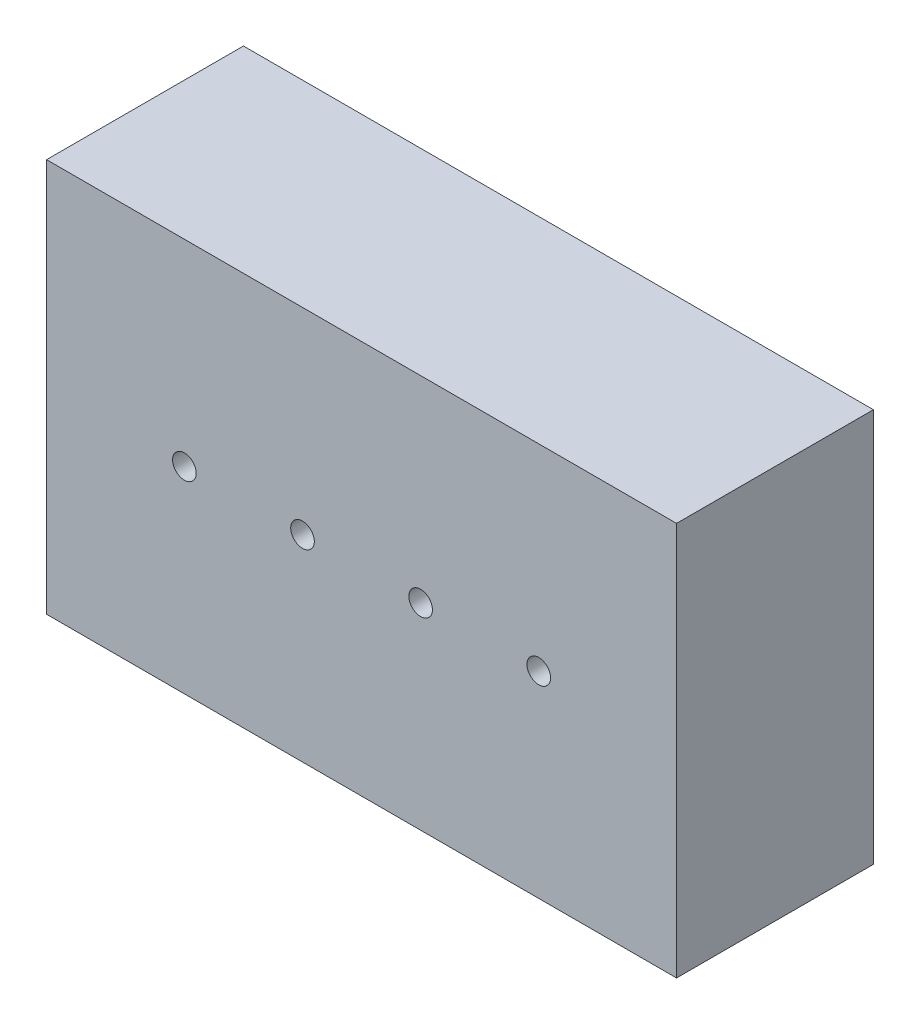
ISO-10303-21;
HEADER;
FILE_DESCRIPTION(('STEP AP214'),'2;1');
FILE_NAME('part.step','',(''),(''),'','','');
FILE_SCHEMA(('AUTOMOTIVE_DESIGN { 1 0 10303 214 1 1 1 1 }'));
ENDSEC;
DATA;
#1=APPLICATION_CONTEXT('core data for automotive mechanical design processes');
#2=APPLICATION_PROTOCOL_DEFINITION('international standard','automotive_design',2000,#1);
#3=PRODUCT_CONTEXT('',#1,'mechanical');
#4=PRODUCT('Part','Part','',(#3));
#5=PRODUCT_RELATED_PRODUCT_CATEGORY('part','',(#4));
#6=PRODUCT_DEFINITION_FORMATION('','',#4);
#7=PRODUCT_DEFINITION_CONTEXT('part definition',#1,'design');
#8=PRODUCT_DEFINITION('design','',#6,#7);
#9=PRODUCT_DEFINITION_SHAPE('','',#8);
#10=(LENGTH_UNIT() NAMED_UNIT(*) SI_UNIT(.MILLI.,.METRE.));
#11=(NAMED_UNIT(*) PLANE_ANGLE_UNIT() SI_UNIT($,.RADIAN.));
#12=(NAMED_UNIT(*) SI_UNIT($,.STERADIAN.) SOLID_ANGLE_UNIT());
#13=UNCERTAINTY_MEASURE_WITH_UNIT(LENGTH_MEASURE(1.E-05),#10,'distance_accuracy_value','');
#14=(GEOMETRIC_REPRESENTATION_CONTEXT(3) GLOBAL_UNCERTAINTY_ASSIGNED_CONTEXT((#13)) GLOBAL_UNIT_ASSIGNED_CONTEXT((#10,
#11,#12)) REPRESENTATION_CONTEXT('',''));
#15=CARTESIAN_POINT('',(0.,0.,0.));
#16=DIRECTION('',(0.,0.,1.));
#17=DIRECTION('',(1.,0.,0.));
#18=AXIS2_PLACEMENT_3D('',#15,#16,#17);
#19=CARTESIAN_POINT('',(22.5,0.,0.));
#20=DIRECTION('',(0.,0.,-1.));
#21=DIRECTION('',(1.,0.,0.));
#22=AXIS2_PLACEMENT_3D('',#19,#20,#21);
#23=CYLINDRICAL_SURFACE('',#22,1.5);
#24=CARTESIAN_POINT('',(22.5,0.,0.));
#25=DIRECTION('',(0.,0.,1.));
#26=DIRECTION('',(1.,0.,0.));
#27=AXIS2_PLACEMENT_3D('',#24,#25,#26);
#28=CIRCLE('',#27,1.5);
#29=CARTESIAN_POINT('',(24.,0.,0.));
#30=VERTEX_POINT('',#29);
#31=EDGE_CURVE('E108',#30,#30,#28,.T.);
#32=ORIENTED_EDGE('',*,*,#31,.F.);
#33=DIRECTION('',(0.,0.,1.));
#34=VECTOR('',#33,1.);
#35=CARTESIAN_POINT('',(24.,0.,0.));
#36=LINE('',#35,#34);
#37=CARTESIAN_POINT('',(24.,0.,25.));
#38=VERTEX_POINT('',#37);
#39=EDGE_CURVE('E10',#30,#38,#36,.T.);
#40=ORIENTED_EDGE('',*,*,#39,.T.);
#41=CARTESIAN_POINT('',(22.5,0.,25.));
#42=DIRECTION('',(0.,0.,-1.));
#43=DIRECTION('',(1.,0.,0.));
#44=AXIS2_PLACEMENT_3D('',#41,#42,#43);
#45=CIRCLE('',#44,1.5);
#46=EDGE_CURVE('E92',#38,#38,#45,.T.);
#47=ORIENTED_EDGE('',*,*,#46,.F.);
#48=ORIENTED_EDGE('',*,*,#39,.F.);
#49=EDGE_LOOP('',(#32,#40,#47,#48));
#50=FACE_BOUND('',#49,.T.);
#51=ADVANCED_FACE('F16',(#50),#23,.F.);
#52=CARTESIAN_POINT('',(7.5,0.,0.));
#53=DIRECTION('',(0.,0.,-1.));
#54=DIRECTION('',(1.,0.,0.));
#55=AXIS2_PLACEMENT_3D('',#52,#53,#54);
#56=CYLINDRICAL_SURFACE('',#55,1.5);
#57=CARTESIAN_POINT('',(7.5,0.,0.));
#58=DIRECTION('',(0.,0.,1.));
#59=DIRECTION('',(1.,0.,0.));
#60=AXIS2_PLACEMENT_3D('',#57,#58,#59);
#61=CIRCLE('',#60,1.5);
#62=CARTESIAN_POINT('',(9.,0.,0.));
#63=VERTEX_POINT('',#62);
#64=EDGE_CURVE('E170',#63,#63,#61,.T.);
#65=ORIENTED_EDGE('',*,*,#64,.F.);
#66=DIRECTION('',(0.,0.,1.));
#67=VECTOR('',#66,1.);
#68=CARTESIAN_POINT('',(9.,0.,0.));
#69=LINE('',#68,#67);
#70=CARTESIAN_POINT('',(9.,0.,25.));
#71=VERTEX_POINT('',#70);
#72=EDGE_CURVE('E26',#63,#71,#69,.T.);
#73=ORIENTED_EDGE('',*,*,#72,.T.);
#74=CARTESIAN_POINT('',(7.5,0.,25.));
#75=DIRECTION('',(0.,0.,-1.));
#76=DIRECTION('',(1.,0.,0.));
#77=AXIS2_PLACEMENT_3D('',#74,#75,#76);
#78=CIRCLE('',#77,1.5);
#79=EDGE_CURVE('E105',#71,#71,#78,.T.);
#80=ORIENTED_EDGE('',*,*,#79,.F.);
#81=ORIENTED_EDGE('',*,*,#72,.F.);
#82=EDGE_LOOP('',(#65,#73,#80,#81));
#83=FACE_BOUND('',#82,.T.);
#84=ADVANCED_FACE('F204',(#83),#56,.F.);
#85=CARTESIAN_POINT('',(-7.5,0.,0.));
#86=DIRECTION('',(0.,0.,-1.));
#87=DIRECTION('',(1.,0.,0.));
#88=AXIS2_PLACEMENT_3D('',#85,#86,#87);
#89=CYLINDRICAL_SURFACE('',#88,1.5);
#90=CARTESIAN_POINT('',(-7.5,0.,0.));
#91=DIRECTION('',(0.,0.,1.));
#92=DIRECTION('',(1.,0.,0.));
#93=AXIS2_PLACEMENT_3D('',#90,#91,#92);
#94=CIRCLE('',#93,1.5);
#95=CARTESIAN_POINT('',(-6.,0.,0.));
#96=VERTEX_POINT('',#95);
#97=EDGE_CURVE('E161',#96,#96,#94,.T.);
#98=ORIENTED_EDGE('',*,*,#97,.F.);
#99=DIRECTION('',(0.,0.,1.));
#100=VECTOR('',#99,1.);
#101=CARTESIAN_POINT('',(-6.,0.,0.));
#102=LINE('',#101,#100);
#103=CARTESIAN_POINT('',(-6.,0.,25.));
#104=VERTEX_POINT('',#103);
#105=EDGE_CURVE('E91',#96,#104,#102,.T.);
#106=ORIENTED_EDGE('',*,*,#105,.T.);
#107=CARTESIAN_POINT('',(-7.5,0.,25.));
#108=DIRECTION('',(0.,0.,-1.));
#109=DIRECTION('',(1.,0.,0.));
#110=AXIS2_PLACEMENT_3D('',#107,#108,#109);
#111=CIRCLE('',#110,1.5);
#112=EDGE_CURVE('E98',#104,#104,#111,.T.);
#113=ORIENTED_EDGE('',*,*,#112,.F.);
#114=ORIENTED_EDGE('',*,*,#105,.F.);
#115=EDGE_LOOP('',(#98,#106,#113,#114));
#116=FACE_BOUND('',#115,.T.);
#117=ADVANCED_FACE('F186',(#116),#89,.F.);
#118=CARTESIAN_POINT('',(-22.5,0.,0.));
#119=DIRECTION('',(0.,0.,-1.));
#120=DIRECTION('',(1.,0.,0.));
#121=AXIS2_PLACEMENT_3D('',#118,#119,#120);
#122=CYLINDRICAL_SURFACE('',#121,1.5);
#123=CARTESIAN_POINT('',(-22.5,0.,0.));
#124=DIRECTION('',(0.,0.,1.));
#125=DIRECTION('',(1.,0.,0.));
#126=AXIS2_PLACEMENT_3D('',#123,#124,#125);
#127=CIRCLE('',#126,1.5);
#128=CARTESIAN_POINT('',(-21.,0.,0.));
#129=VERTEX_POINT('',#128);
#130=EDGE_CURVE('E89',#129,#129,#127,.T.);
#131=ORIENTED_EDGE('',*,*,#130,.F.);
#132=DIRECTION('',(0.,0.,1.));
#133=VECTOR('',#132,1.);
#134=CARTESIAN_POINT('',(-21.,0.,0.));
#135=LINE('',#134,#133);
#136=CARTESIAN_POINT('',(-21.,0.,25.));
#137=VERTEX_POINT('',#136);
#138=EDGE_CURVE('E85',#129,#137,#135,.T.);
#139=ORIENTED_EDGE('',*,*,#138,.T.);
#140=CARTESIAN_POINT('',(-22.5,0.,25.));
#141=DIRECTION('',(0.,0.,-1.));
#142=DIRECTION('',(1.,0.,0.));
#143=AXIS2_PLACEMENT_3D('',#140,#141,#142);
#144=CIRCLE('',#143,1.5);
#145=EDGE_CURVE('E87',#137,#137,#144,.T.);
#146=ORIENTED_EDGE('',*,*,#145,.F.);
#147=ORIENTED_EDGE('',*,*,#138,.F.);
#148=EDGE_LOOP('',(#131,#139,#146,#147));
#149=FACE_BOUND('',#148,.T.);
#150=ADVANCED_FACE('F18',(#149),#122,.F.);
#151=CARTESIAN_POINT('',(40.,25.,0.));
#152=DIRECTION('',(0.,-1.,0.));
#153=DIRECTION('',(0.,0.,-1.));
#154=AXIS2_PLACEMENT_3D('',#151,#152,#153);
#155=PLANE('',#154);
#156=DIRECTION('',(-1.,0.,0.));
#157=VECTOR('',#156,1.);
#158=CARTESIAN_POINT('',(40.,25.,0.));
#159=LINE('',#158,#157);
#160=CARTESIAN_POINT('',(40.,25.,0.));
#161=VERTEX_POINT('',#160);
#162=CARTESIAN_POINT('',(-40.,25.,0.));
#163=VERTEX_POINT('',#162);
#164=EDGE_CURVE('E140',#161,#163,#159,.T.);
#165=ORIENTED_EDGE('',*,*,#164,.T.);
#166=DIRECTION('',(0.,0.,1.));
#167=VECTOR('',#166,1.);
#168=CARTESIAN_POINT('',(-40.,25.,0.));
#169=LINE('',#168,#167);
#170=CARTESIAN_POINT('',(-40.,25.,25.));
#171=VERTEX_POINT('',#170);
#172=EDGE_CURVE('E157',#163,#171,#169,.T.);
#173=ORIENTED_EDGE('',*,*,#172,.T.);
#174=DIRECTION('',(-1.,0.,0.));
#175=VECTOR('',#174,1.);
#176=CARTESIAN_POINT('',(40.,25.,25.));
#177=LINE('',#176,#175);
#178=CARTESIAN_POINT('',(40.,25.,25.));
#179=VERTEX_POINT('',#178);
#180=EDGE_CURVE('E99',#179,#171,#177,.T.);
#181=ORIENTED_EDGE('',*,*,#180,.F.);
#182=DIRECTION('',(0.,0.,1.));
#183=VECTOR('',#182,1.);
#184=CARTESIAN_POINT('',(40.,25.,0.));
#185=LINE('',#184,#183);
#186=EDGE_CURVE('E169',#161,#179,#185,.T.);
#187=ORIENTED_EDGE('',*,*,#186,.F.);
#188=EDGE_LOOP('',(#165,#173,#181,#187));
#189=FACE_BOUND('',#188,.T.);
#190=ADVANCED_FACE('F189',(#189),#155,.F.);
#191=CARTESIAN_POINT('',(0.,0.,25.));
#192=DIRECTION('',(0.,0.,1.));
#193=DIRECTION('',(1.,0.,0.));
#194=AXIS2_PLACEMENT_3D('',#191,#192,#193);
#195=PLANE('',#194);
#196=ORIENTED_EDGE('',*,*,#46,.T.);
#197=EDGE_LOOP('',(#196));
#198=FACE_BOUND('',#197,.T.);
#199=ORIENTED_EDGE('',*,*,#79,.T.);
#200=EDGE_LOOP('',(#199));
#201=FACE_BOUND('',#200,.T.);
#202=ORIENTED_EDGE('',*,*,#112,.T.);
#203=EDGE_LOOP('',(#202));
#204=FACE_BOUND('',#203,.T.);
#205=ORIENTED_EDGE('',*,*,#145,.T.);
#206=EDGE_LOOP('',(#205));
#207=FACE_BOUND('',#206,.T.);
#208=DIRECTION('',(1.,0.,0.));
#209=VECTOR('',#208,1.);
#210=CARTESIAN_POINT('',(-40.,-25.,25.));
#211=LINE('',#210,#209);
#212=CARTESIAN_POINT('',(-40.,-25.,25.));
#213=VERTEX_POINT('',#212);
#214=CARTESIAN_POINT('',(40.,-25.,25.));
#215=VERTEX_POINT('',#214);
#216=EDGE_CURVE('E131',#213,#215,#211,.T.);
#217=ORIENTED_EDGE('',*,*,#216,.T.);
#218=DIRECTION('',(0.,1.,0.));
#219=VECTOR('',#218,1.);
#220=CARTESIAN_POINT('',(40.,-25.,25.));
#221=LINE('',#220,#219);
#222=EDGE_CURVE('E144',#215,#179,#221,.T.);
#223=ORIENTED_EDGE('',*,*,#222,.T.);
#224=ORIENTED_EDGE('',*,*,#180,.T.);
#225=DIRECTION('',(0.,-1.,0.));
#226=VECTOR('',#225,1.);
#227=CARTESIAN_POINT('',(-40.,25.,25.));
#228=LINE('',#227,#226);
#229=EDGE_CURVE('E155',#171,#213,#228,.T.);
#230=ORIENTED_EDGE('',*,*,#229,.T.);
#231=EDGE_LOOP('',(#217,#223,#224,#230));
#232=FACE_BOUND('',#231,.T.);
#233=ADVANCED_FACE('F95',(#198,#201,#204,#207,#232),#195,.T.);
#234=CARTESIAN_POINT('',(0.,0.,0.));
#235=DIRECTION('',(0.,0.,1.));
#236=DIRECTION('',(1.,0.,0.));
#237=AXIS2_PLACEMENT_3D('',#234,#235,#236);
#238=PLANE('',#237);
#239=ORIENTED_EDGE('',*,*,#31,.T.);
#240=EDGE_LOOP('',(#239));
#241=FACE_BOUND('',#240,.T.);
#242=ORIENTED_EDGE('',*,*,#64,.T.);
#243=EDGE_LOOP('',(#242));
#244=FACE_BOUND('',#243,.T.);
#245=ORIENTED_EDGE('',*,*,#97,.T.);
#246=EDGE_LOOP('',(#245));
#247=FACE_BOUND('',#246,.T.);
#248=ORIENTED_EDGE('',*,*,#130,.T.);
#249=EDGE_LOOP('',(#248));
#250=FACE_BOUND('',#249,.T.);
#251=DIRECTION('',(0.,-1.,0.));
#252=VECTOR('',#251,1.);
#253=CARTESIAN_POINT('',(-40.,25.,0.));
#254=LINE('',#253,#252);
#255=CARTESIAN_POINT('',(-40.,-25.,0.));
#256=VERTEX_POINT('',#255);
#257=EDGE_CURVE('E151',#163,#256,#254,.T.);
#258=ORIENTED_EDGE('',*,*,#257,.F.);
#259=ORIENTED_EDGE('',*,*,#164,.F.);
#260=DIRECTION('',(0.,1.,0.));
#261=VECTOR('',#260,1.);
#262=CARTESIAN_POINT('',(40.,-25.,0.));
#263=LINE('',#262,#261);
#264=CARTESIAN_POINT('',(40.,-25.,0.));
#265=VERTEX_POINT('',#264);
#266=EDGE_CURVE('E165',#265,#161,#263,.T.);
#267=ORIENTED_EDGE('',*,*,#266,.F.);
#268=DIRECTION('',(1.,0.,0.));
#269=VECTOR('',#268,1.);
#270=CARTESIAN_POINT('',(-40.,-25.,0.));
#271=LINE('',#270,#269);
#272=EDGE_CURVE('E136',#256,#265,#271,.T.);
#273=ORIENTED_EDGE('',*,*,#272,.F.);
#274=EDGE_LOOP('',(#258,#259,#267,#273));
#275=FACE_BOUND('',#274,.T.);
#276=ADVANCED_FACE('F183',(#241,#244,#247,#250,#275),#238,.F.);
#277=CARTESIAN_POINT('',(40.,-25.,0.));
#278=DIRECTION('',(-1.,0.,0.));
#279=DIRECTION('',(0.,0.,1.));
#280=AXIS2_PLACEMENT_3D('',#277,#278,#279);
#281=PLANE('',#280);
#282=ORIENTED_EDGE('',*,*,#266,.T.);
#283=ORIENTED_EDGE('',*,*,#186,.T.);
#284=ORIENTED_EDGE('',*,*,#222,.F.);
#285=DIRECTION('',(0.,0.,1.));
#286=VECTOR('',#285,1.);
#287=CARTESIAN_POINT('',(40.,-25.,0.));
#288=LINE('',#287,#286);
#289=EDGE_CURVE('E135',#265,#215,#288,.T.);
#290=ORIENTED_EDGE('',*,*,#289,.F.);
#291=EDGE_LOOP('',(#282,#283,#284,#290));
#292=FACE_BOUND('',#291,.T.);
#293=ADVANCED_FACE('F197',(#292),#281,.F.);
#294=CARTESIAN_POINT('',(-40.,25.,0.));
#295=DIRECTION('',(1.,0.,0.));
#296=DIRECTION('',(0.,1.,0.));
#297=AXIS2_PLACEMENT_3D('',#294,#295,#296);
#298=PLANE('',#297);
#299=ORIENTED_EDGE('',*,*,#257,.T.);
#300=DIRECTION('',(0.,0.,1.));
#301=VECTOR('',#300,1.);
#302=CARTESIAN_POINT('',(-40.,-25.,0.));
#303=LINE('',#302,#301);
#304=EDGE_CURVE('E134',#256,#213,#303,.T.);
#305=ORIENTED_EDGE('',*,*,#304,.T.);
#306=ORIENTED_EDGE('',*,*,#229,.F.);
#307=ORIENTED_EDGE('',*,*,#172,.F.);
#308=EDGE_LOOP('',(#299,#305,#306,#307));
#309=FACE_BOUND('',#308,.T.);
#310=ADVANCED_FACE('F249',(#309),#298,.F.);
#311=CARTESIAN_POINT('',(-40.,-25.,0.));
#312=DIRECTION('',(0.,1.,0.));
#313=DIRECTION('',(1.,0.,0.));
#314=AXIS2_PLACEMENT_3D('',#311,#312,#313);
#315=PLANE('',#314);
#316=ORIENTED_EDGE('',*,*,#272,.T.);
#317=ORIENTED_EDGE('',*,*,#289,.T.);
#318=ORIENTED_EDGE('',*,*,#216,.F.);
#319=ORIENTED_EDGE('',*,*,#304,.F.);
#320=EDGE_LOOP('',(#316,#317,#318,#319));
#321=FACE_BOUND('',#320,.T.);
#322=ADVANCED_FACE('F260',(#321),#315,.F.);
#323=CLOSED_SHELL('',(#51,#84,#117,#150,#190,#233,#276,#293,#310,#322));
#324=MANIFOLD_SOLID_BREP('B1',#323);
#325=ADVANCED_BREP_SHAPE_REPRESENTATION('',(#18,#324),#14);
#326=SHAPE_DEFINITION_REPRESENTATION(#9,#325);
ENDSEC;
END-ISO-10303-21;
